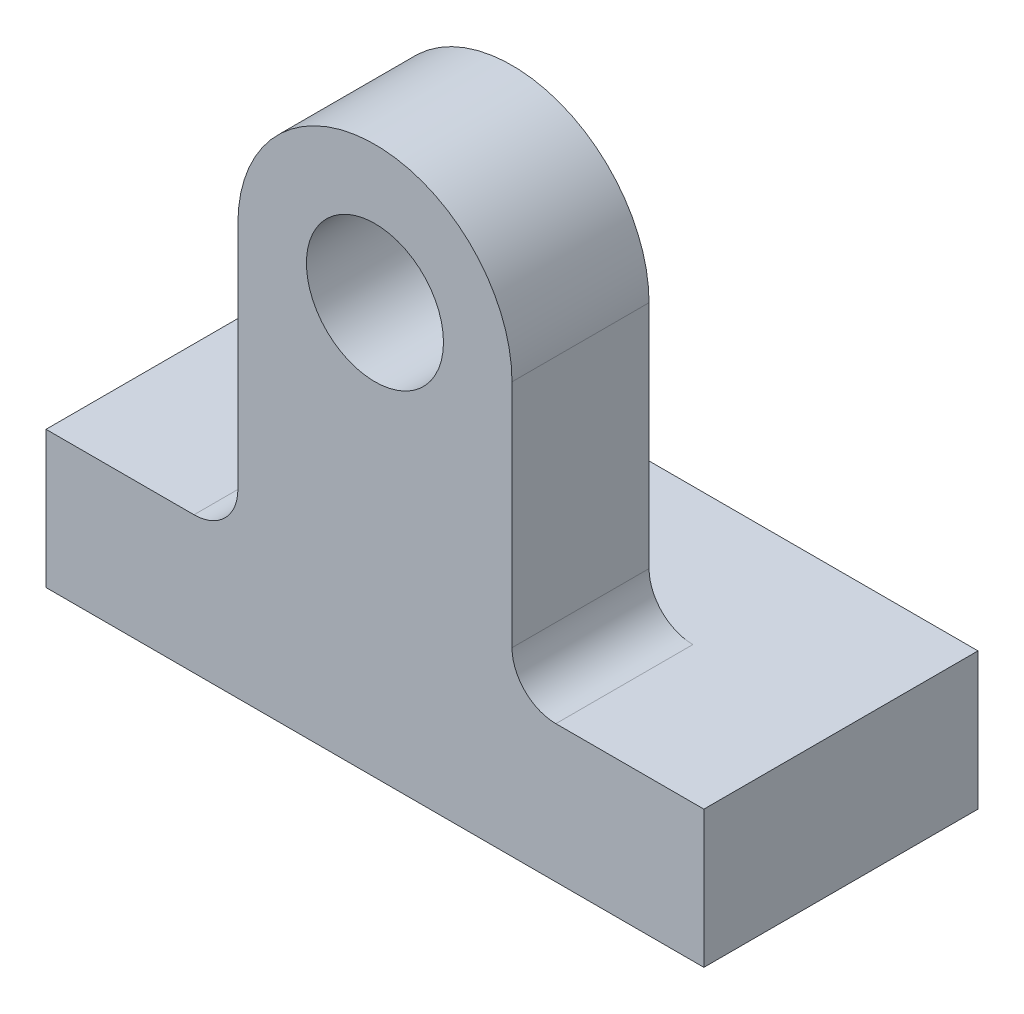
ISO-10303-21;
HEADER;
FILE_DESCRIPTION(('STEP AP214'),'2;1');
FILE_NAME('part.step','',(''),(''),'','','');
FILE_SCHEMA(('AUTOMOTIVE_DESIGN { 1 0 10303 214 1 1 1 1 }'));
ENDSEC;
DATA;
#1=APPLICATION_CONTEXT('core data for automotive mechanical design processes');
#2=APPLICATION_PROTOCOL_DEFINITION('international standard','automotive_design',2000,#1);
#3=PRODUCT_CONTEXT('',#1,'mechanical');
#4=PRODUCT('Part','Part','',(#3));
#5=PRODUCT_RELATED_PRODUCT_CATEGORY('part','',(#4));
#6=PRODUCT_DEFINITION_FORMATION('','',#4);
#7=PRODUCT_DEFINITION_CONTEXT('part definition',#1,'design');
#8=PRODUCT_DEFINITION('design','',#6,#7);
#9=PRODUCT_DEFINITION_SHAPE('','',#8);
#10=(LENGTH_UNIT() NAMED_UNIT(*) SI_UNIT(.MILLI.,.METRE.));
#11=(NAMED_UNIT(*) PLANE_ANGLE_UNIT() SI_UNIT($,.RADIAN.));
#12=(NAMED_UNIT(*) SI_UNIT($,.STERADIAN.) SOLID_ANGLE_UNIT());
#13=UNCERTAINTY_MEASURE_WITH_UNIT(LENGTH_MEASURE(1.E-05),#10,'distance_accuracy_value','');
#14=(GEOMETRIC_REPRESENTATION_CONTEXT(3) GLOBAL_UNCERTAINTY_ASSIGNED_CONTEXT((#13)) GLOBAL_UNIT_ASSIGNED_CONTEXT((#10,
#11,#12)) REPRESENTATION_CONTEXT('',''));
#15=CARTESIAN_POINT('',(0.,0.,0.));
#16=DIRECTION('',(0.,0.,1.));
#17=DIRECTION('',(1.,0.,0.));
#18=AXIS2_PLACEMENT_3D('',#15,#16,#17);
#19=CARTESIAN_POINT('',(0.,25.,50.));
#20=DIRECTION('',(0.,1.,0.));
#21=DIRECTION('',(-1.,0.,0.));
#22=AXIS2_PLACEMENT_3D('',#19,#20,#21);
#23=PLANE('',#22);
#24=DIRECTION('',(-1.,0.,0.));
#25=VECTOR('',#24,1.);
#26=CARTESIAN_POINT('',(0.,25.,25.));
#27=LINE('',#26,#25);
#28=CARTESIAN_POINT('',(33.,25.,25.));
#29=VERTEX_POINT('',#28);
#30=CARTESIAN_POINT('',(-33.,25.,25.));
#31=VERTEX_POINT('',#30);
#32=EDGE_CURVE('E126',#29,#31,#27,.T.);
#33=ORIENTED_EDGE('',*,*,#32,.F.);
#34=DIRECTION('',(0.,0.,1.));
#35=VECTOR('',#34,1.);
#36=CARTESIAN_POINT('',(33.,25.,50.));
#37=LINE('',#36,#35);
#38=CARTESIAN_POINT('',(33.,25.,50.));
#39=VERTEX_POINT('',#38);
#40=EDGE_CURVE('E200',#29,#39,#37,.T.);
#41=ORIENTED_EDGE('',*,*,#40,.T.);
#42=DIRECTION('',(1.,0.,0.));
#43=VECTOR('',#42,1.);
#44=CARTESIAN_POINT('',(0.,25.,50.));
#45=LINE('',#44,#43);
#46=CARTESIAN_POINT('',(60.,25.,50.));
#47=VERTEX_POINT('',#46);
#48=EDGE_CURVE('E158',#39,#47,#45,.T.);
#49=ORIENTED_EDGE('',*,*,#48,.T.);
#50=DIRECTION('',(0.,0.,-1.));
#51=VECTOR('',#50,1.);
#52=CARTESIAN_POINT('',(60.,25.,50.));
#53=LINE('',#52,#51);
#54=CARTESIAN_POINT('',(60.,25.,0.));
#55=VERTEX_POINT('',#54);
#56=EDGE_CURVE('E169',#47,#55,#53,.T.);
#57=ORIENTED_EDGE('',*,*,#56,.T.);
#58=DIRECTION('',(1.,0.,0.));
#59=VECTOR('',#58,1.);
#60=CARTESIAN_POINT('',(0.,25.,0.));
#61=LINE('',#60,#59);
#62=CARTESIAN_POINT('',(-60.,25.,0.));
#63=VERTEX_POINT('',#62);
#64=EDGE_CURVE('E147',#63,#55,#61,.T.);
#65=ORIENTED_EDGE('',*,*,#64,.F.);
#66=DIRECTION('',(0.,0.,-1.));
#67=VECTOR('',#66,1.);
#68=CARTESIAN_POINT('',(-60.,25.,50.));
#69=LINE('',#68,#67);
#70=CARTESIAN_POINT('',(-60.,25.,50.));
#71=VERTEX_POINT('',#70);
#72=EDGE_CURVE('E193',#71,#63,#69,.T.);
#73=ORIENTED_EDGE('',*,*,#72,.F.);
#74=CARTESIAN_POINT('',(-33.,25.,50.));
#75=VERTEX_POINT('',#74);
#76=EDGE_CURVE('E153',#71,#75,#45,.T.);
#77=ORIENTED_EDGE('',*,*,#76,.T.);
#78=DIRECTION('',(0.,0.,1.));
#79=VECTOR('',#78,1.);
#80=CARTESIAN_POINT('',(-33.,25.,50.));
#81=LINE('',#80,#79);
#82=EDGE_CURVE('E196',#75,#31,#81,.F.);
#83=ORIENTED_EDGE('',*,*,#82,.T.);
#84=EDGE_LOOP('',(#33,#41,#49,#57,#65,#73,#77,#83));
#85=FACE_BOUND('',#84,.T.);
#86=ADVANCED_FACE('F37',(#85),#23,.T.);
#87=CARTESIAN_POINT('',(-60.,0.,50.));
#88=DIRECTION('',(-1.,0.,0.));
#89=DIRECTION('',(0.,0.,1.));
#90=AXIS2_PLACEMENT_3D('',#87,#88,#89);
#91=PLANE('',#90);
#92=DIRECTION('',(0.,1.,0.));
#93=VECTOR('',#92,1.);
#94=CARTESIAN_POINT('',(-60.,0.,0.));
#95=LINE('',#94,#93);
#96=CARTESIAN_POINT('',(-60.,0.,0.));
#97=VERTEX_POINT('',#96);
#98=EDGE_CURVE('E173',#97,#63,#95,.T.);
#99=ORIENTED_EDGE('',*,*,#98,.F.);
#100=DIRECTION('',(0.,0.,-1.));
#101=VECTOR('',#100,1.);
#102=CARTESIAN_POINT('',(-60.,0.,50.));
#103=LINE('',#102,#101);
#104=CARTESIAN_POINT('',(-60.,0.,50.));
#105=VERTEX_POINT('',#104);
#106=EDGE_CURVE('E190',#105,#97,#103,.T.);
#107=ORIENTED_EDGE('',*,*,#106,.F.);
#108=DIRECTION('',(0.,1.,0.));
#109=VECTOR('',#108,1.);
#110=CARTESIAN_POINT('',(-60.,0.,50.));
#111=LINE('',#110,#109);
#112=EDGE_CURVE('E157',#105,#71,#111,.T.);
#113=ORIENTED_EDGE('',*,*,#112,.T.);
#114=ORIENTED_EDGE('',*,*,#72,.T.);
#115=EDGE_LOOP('',(#99,#107,#113,#114));
#116=FACE_BOUND('',#115,.T.);
#117=ADVANCED_FACE('F282',(#116),#91,.T.);
#118=CARTESIAN_POINT('',(0.,0.,50.));
#119=DIRECTION('',(0.,1.,0.));
#120=DIRECTION('',(-1.,0.,0.));
#121=AXIS2_PLACEMENT_3D('',#118,#119,#120);
#122=PLANE('',#121);
#123=DIRECTION('',(1.,0.,0.));
#124=VECTOR('',#123,1.);
#125=CARTESIAN_POINT('',(0.,0.,0.));
#126=LINE('',#125,#124);
#127=CARTESIAN_POINT('',(60.,0.,0.));
#128=VERTEX_POINT('',#127);
#129=EDGE_CURVE('E177',#97,#128,#126,.T.);
#130=ORIENTED_EDGE('',*,*,#129,.T.);
#131=DIRECTION('',(0.,0.,-1.));
#132=VECTOR('',#131,1.);
#133=CARTESIAN_POINT('',(60.,0.,50.));
#134=LINE('',#133,#132);
#135=CARTESIAN_POINT('',(60.,0.,50.));
#136=VERTEX_POINT('',#135);
#137=EDGE_CURVE('E186',#136,#128,#134,.T.);
#138=ORIENTED_EDGE('',*,*,#137,.F.);
#139=DIRECTION('',(1.,0.,0.));
#140=VECTOR('',#139,1.);
#141=CARTESIAN_POINT('',(0.,0.,50.));
#142=LINE('',#141,#140);
#143=EDGE_CURVE('E162',#105,#136,#142,.T.);
#144=ORIENTED_EDGE('',*,*,#143,.F.);
#145=ORIENTED_EDGE('',*,*,#106,.T.);
#146=EDGE_LOOP('',(#130,#138,#144,#145));
#147=FACE_BOUND('',#146,.T.);
#148=ADVANCED_FACE('F284',(#147),#122,.F.);
#149=CARTESIAN_POINT('',(60.,0.,50.));
#150=DIRECTION('',(-1.,0.,0.));
#151=DIRECTION('',(0.,-1.,0.));
#152=AXIS2_PLACEMENT_3D('',#149,#150,#151);
#153=PLANE('',#152);
#154=DIRECTION('',(0.,1.,0.));
#155=VECTOR('',#154,1.);
#156=CARTESIAN_POINT('',(60.,0.,0.));
#157=LINE('',#156,#155);
#158=EDGE_CURVE('E180',#128,#55,#157,.T.);
#159=ORIENTED_EDGE('',*,*,#158,.T.);
#160=ORIENTED_EDGE('',*,*,#56,.F.);
#161=DIRECTION('',(0.,1.,0.));
#162=VECTOR('',#161,1.);
#163=CARTESIAN_POINT('',(60.,0.,50.));
#164=LINE('',#163,#162);
#165=EDGE_CURVE('E165',#136,#47,#164,.T.);
#166=ORIENTED_EDGE('',*,*,#165,.F.);
#167=ORIENTED_EDGE('',*,*,#137,.T.);
#168=EDGE_LOOP('',(#159,#160,#166,#167));
#169=FACE_BOUND('',#168,.T.);
#170=ADVANCED_FACE('F275',(#169),#153,.F.);
#171=CARTESIAN_POINT('',(0.,0.,50.));
#172=DIRECTION('',(0.,0.,1.));
#173=DIRECTION('',(1.,0.,0.));
#174=AXIS2_PLACEMENT_3D('',#171,#172,#173);
#175=PLANE('',#174);
#176=ORIENTED_EDGE('',*,*,#76,.F.);
#177=ORIENTED_EDGE('',*,*,#112,.F.);
#178=ORIENTED_EDGE('',*,*,#143,.T.);
#179=ORIENTED_EDGE('',*,*,#165,.T.);
#180=ORIENTED_EDGE('',*,*,#48,.F.);
#181=CARTESIAN_POINT('',(33.,33.,50.));
#182=DIRECTION('',(0.,0.,1.));
#183=DIRECTION('',(1.,0.,0.));
#184=AXIS2_PLACEMENT_3D('',#181,#182,#183);
#185=CIRCLE('',#184,8.);
#186=CARTESIAN_POINT('',(25.,33.,50.));
#187=VERTEX_POINT('',#186);
#188=EDGE_CURVE('E209',#39,#187,#185,.F.);
#189=ORIENTED_EDGE('',*,*,#188,.T.);
#190=DIRECTION('',(0.,1.,0.));
#191=VECTOR('',#190,1.);
#192=CARTESIAN_POINT('',(25.,0.,50.));
#193=LINE('',#192,#191);
#194=CARTESIAN_POINT('',(25.,75.,50.));
#195=VERTEX_POINT('',#194);
#196=EDGE_CURVE('E231',#187,#195,#193,.T.);
#197=ORIENTED_EDGE('',*,*,#196,.T.);
#198=CARTESIAN_POINT('',(0.,75.,50.));
#199=DIRECTION('',(0.,0.,1.));
#200=DIRECTION('',(1.,0.,0.));
#201=AXIS2_PLACEMENT_3D('',#198,#199,#200);
#202=CIRCLE('',#201,25.);
#203=CARTESIAN_POINT('',(-25.,75.,50.));
#204=VERTEX_POINT('',#203);
#205=EDGE_CURVE('E139',#204,#195,#202,.F.);
#206=ORIENTED_EDGE('',*,*,#205,.F.);
#207=DIRECTION('',(0.,1.,0.));
#208=VECTOR('',#207,1.);
#209=CARTESIAN_POINT('',(-25.,0.,50.));
#210=LINE('',#209,#208);
#211=CARTESIAN_POINT('',(-25.,33.,50.));
#212=VERTEX_POINT('',#211);
#213=EDGE_CURVE('E222',#212,#204,#210,.T.);
#214=ORIENTED_EDGE('',*,*,#213,.F.);
#215=CARTESIAN_POINT('',(-33.,33.,50.));
#216=DIRECTION('',(0.,0.,1.));
#217=DIRECTION('',(1.,0.,0.));
#218=AXIS2_PLACEMENT_3D('',#215,#216,#217);
#219=CIRCLE('',#218,8.);
#220=EDGE_CURVE('E46',#212,#75,#219,.F.);
#221=ORIENTED_EDGE('',*,*,#220,.T.);
#222=EDGE_LOOP('',(#176,#177,#178,#179,#180,#189,#197,#206,#214,#221));
#223=FACE_BOUND('',#222,.T.);
#224=CARTESIAN_POINT('',(0.,75.,50.));
#225=DIRECTION('',(0.,0.,1.));
#226=DIRECTION('',(1.,0.,0.));
#227=AXIS2_PLACEMENT_3D('',#224,#225,#226);
#228=CIRCLE('',#227,12.5);
#229=CARTESIAN_POINT('',(12.5,75.,50.));
#230=VERTEX_POINT('',#229);
#231=EDGE_CURVE('E237',#230,#230,#228,.T.);
#232=ORIENTED_EDGE('',*,*,#231,.F.);
#233=EDGE_LOOP('',(#232));
#234=FACE_BOUND('',#233,.T.);
#235=ADVANCED_FACE('F219',(#223,#234),#175,.T.);
#236=CARTESIAN_POINT('',(0.,0.,0.));
#237=DIRECTION('',(0.,0.,1.));
#238=DIRECTION('',(1.,0.,0.));
#239=AXIS2_PLACEMENT_3D('',#236,#237,#238);
#240=PLANE('',#239);
#241=ORIENTED_EDGE('',*,*,#64,.T.);
#242=ORIENTED_EDGE('',*,*,#158,.F.);
#243=ORIENTED_EDGE('',*,*,#129,.F.);
#244=ORIENTED_EDGE('',*,*,#98,.T.);
#245=EDGE_LOOP('',(#241,#242,#243,#244));
#246=FACE_BOUND('',#245,.T.);
#247=ADVANCED_FACE('F280',(#246),#240,.F.);
#248=CARTESIAN_POINT('',(-25.,0.,25.));
#249=DIRECTION('',(1.,0.,0.));
#250=DIRECTION('',(0.,0.,-1.));
#251=AXIS2_PLACEMENT_3D('',#248,#249,#250);
#252=PLANE('',#251);
#253=DIRECTION('',(0.,1.,0.));
#254=VECTOR('',#253,1.);
#255=CARTESIAN_POINT('',(-25.,0.,25.));
#256=LINE('',#255,#254);
#257=CARTESIAN_POINT('',(-25.,33.,25.));
#258=VERTEX_POINT('',#257);
#259=CARTESIAN_POINT('',(-25.,75.,25.));
#260=VERTEX_POINT('',#259);
#261=EDGE_CURVE('E131',#258,#260,#256,.T.);
#262=ORIENTED_EDGE('',*,*,#261,.F.);
#263=DIRECTION('',(0.,0.,1.));
#264=VECTOR('',#263,1.);
#265=CARTESIAN_POINT('',(-25.,33.,25.));
#266=LINE('',#265,#264);
#267=EDGE_CURVE('E206',#258,#212,#266,.T.);
#268=ORIENTED_EDGE('',*,*,#267,.T.);
#269=ORIENTED_EDGE('',*,*,#213,.T.);
#270=DIRECTION('',(0.,0.,1.));
#271=VECTOR('',#270,1.);
#272=CARTESIAN_POINT('',(-25.,75.,25.));
#273=LINE('',#272,#271);
#274=EDGE_CURVE('E141',#260,#204,#273,.T.);
#275=ORIENTED_EDGE('',*,*,#274,.F.);
#276=EDGE_LOOP('',(#262,#268,#269,#275));
#277=FACE_BOUND('',#276,.T.);
#278=ADVANCED_FACE('F226',(#277),#252,.F.);
#279=CARTESIAN_POINT('',(0.,75.,25.));
#280=DIRECTION('',(0.,0.,1.));
#281=DIRECTION('',(1.,0.,0.));
#282=AXIS2_PLACEMENT_3D('',#279,#280,#281);
#283=CYLINDRICAL_SURFACE('',#282,25.);
#284=ORIENTED_EDGE('',*,*,#205,.T.);
#285=DIRECTION('',(0.,0.,1.));
#286=VECTOR('',#285,1.);
#287=CARTESIAN_POINT('',(25.,75.,25.));
#288=LINE('',#287,#286);
#289=CARTESIAN_POINT('',(25.,75.,25.));
#290=VERTEX_POINT('',#289);
#291=EDGE_CURVE('E118',#290,#195,#288,.T.);
#292=ORIENTED_EDGE('',*,*,#291,.F.);
#293=CARTESIAN_POINT('',(0.,75.,25.));
#294=DIRECTION('',(0.,0.,1.));
#295=DIRECTION('',(1.,0.,0.));
#296=AXIS2_PLACEMENT_3D('',#293,#294,#295);
#297=CIRCLE('',#296,25.);
#298=EDGE_CURVE('E125',#260,#290,#297,.F.);
#299=ORIENTED_EDGE('',*,*,#298,.F.);
#300=ORIENTED_EDGE('',*,*,#274,.T.);
#301=EDGE_LOOP('',(#284,#292,#299,#300));
#302=FACE_BOUND('',#301,.T.);
#303=ADVANCED_FACE('F137',(#302),#283,.T.);
#304=CARTESIAN_POINT('',(25.,0.,25.));
#305=DIRECTION('',(1.,0.,0.));
#306=DIRECTION('',(0.,0.,-1.));
#307=AXIS2_PLACEMENT_3D('',#304,#305,#306);
#308=PLANE('',#307);
#309=ORIENTED_EDGE('',*,*,#196,.F.);
#310=DIRECTION('',(0.,0.,1.));
#311=VECTOR('',#310,1.);
#312=CARTESIAN_POINT('',(25.,33.,25.));
#313=LINE('',#312,#311);
#314=CARTESIAN_POINT('',(25.,33.,25.));
#315=VERTEX_POINT('',#314);
#316=EDGE_CURVE('E121',#187,#315,#313,.F.);
#317=ORIENTED_EDGE('',*,*,#316,.T.);
#318=DIRECTION('',(0.,1.,0.));
#319=VECTOR('',#318,1.);
#320=CARTESIAN_POINT('',(25.,0.,25.));
#321=LINE('',#320,#319);
#322=EDGE_CURVE('E113',#315,#290,#321,.T.);
#323=ORIENTED_EDGE('',*,*,#322,.T.);
#324=ORIENTED_EDGE('',*,*,#291,.T.);
#325=EDGE_LOOP('',(#309,#317,#323,#324));
#326=FACE_BOUND('',#325,.T.);
#327=ADVANCED_FACE('F116',(#326),#308,.T.);
#328=CARTESIAN_POINT('',(0.,75.,25.));
#329=DIRECTION('',(0.,0.,1.));
#330=DIRECTION('',(1.,0.,0.));
#331=AXIS2_PLACEMENT_3D('',#328,#329,#330);
#332=CYLINDRICAL_SURFACE('',#331,12.5);
#333=CARTESIAN_POINT('',(0.,75.,25.));
#334=DIRECTION('',(0.,0.,1.));
#335=DIRECTION('',(1.,0.,0.));
#336=AXIS2_PLACEMENT_3D('',#333,#334,#335);
#337=CIRCLE('',#336,12.5);
#338=CARTESIAN_POINT('',(12.5,75.,25.));
#339=VERTEX_POINT('',#338);
#340=EDGE_CURVE('E142',#339,#339,#337,.T.);
#341=ORIENTED_EDGE('',*,*,#340,.F.);
#342=EDGE_LOOP('',(#341));
#343=FACE_BOUND('',#342,.T.);
#344=ORIENTED_EDGE('',*,*,#231,.T.);
#345=EDGE_LOOP('',(#344));
#346=FACE_BOUND('',#345,.T.);
#347=ADVANCED_FACE('F303',(#343,#346),#332,.F.);
#348=CARTESIAN_POINT('',(0.,0.,25.));
#349=DIRECTION('',(0.,0.,1.));
#350=DIRECTION('',(1.,0.,0.));
#351=AXIS2_PLACEMENT_3D('',#348,#349,#350);
#352=PLANE('',#351);
#353=ORIENTED_EDGE('',*,*,#32,.T.);
#354=CARTESIAN_POINT('',(-33.,33.,25.));
#355=DIRECTION('',(0.,0.,1.));
#356=DIRECTION('',(1.,0.,0.));
#357=AXIS2_PLACEMENT_3D('',#354,#355,#356);
#358=CIRCLE('',#357,8.);
#359=EDGE_CURVE('E11',#31,#258,#358,.T.);
#360=ORIENTED_EDGE('',*,*,#359,.T.);
#361=ORIENTED_EDGE('',*,*,#261,.T.);
#362=ORIENTED_EDGE('',*,*,#298,.T.);
#363=ORIENTED_EDGE('',*,*,#322,.F.);
#364=CARTESIAN_POINT('',(33.,33.,25.));
#365=DIRECTION('',(0.,0.,1.));
#366=DIRECTION('',(1.,0.,0.));
#367=AXIS2_PLACEMENT_3D('',#364,#365,#366);
#368=CIRCLE('',#367,8.);
#369=EDGE_CURVE('E212',#315,#29,#368,.T.);
#370=ORIENTED_EDGE('',*,*,#369,.T.);
#371=EDGE_LOOP('',(#353,#360,#361,#362,#363,#370));
#372=FACE_BOUND('',#371,.T.);
#373=ORIENTED_EDGE('',*,*,#340,.T.);
#374=EDGE_LOOP('',(#373));
#375=FACE_BOUND('',#374,.T.);
#376=ADVANCED_FACE('F129',(#372,#375),#352,.F.);
#377=CARTESIAN_POINT('',(33.,33.,50.));
#378=DIRECTION('',(0.,0.,-1.));
#379=DIRECTION('',(-1.,0.,0.));
#380=AXIS2_PLACEMENT_3D('',#377,#378,#379);
#381=CYLINDRICAL_SURFACE('',#380,8.);
#382=ORIENTED_EDGE('',*,*,#369,.F.);
#383=ORIENTED_EDGE('',*,*,#316,.F.);
#384=ORIENTED_EDGE('',*,*,#188,.F.);
#385=ORIENTED_EDGE('',*,*,#40,.F.);
#386=EDGE_LOOP('',(#382,#383,#384,#385));
#387=FACE_BOUND('',#386,.T.);
#388=ADVANCED_FACE('F297',(#387),#381,.F.);
#389=CARTESIAN_POINT('',(-33.,33.,25.));
#390=DIRECTION('',(0.,0.,1.));
#391=DIRECTION('',(1.,0.,0.));
#392=AXIS2_PLACEMENT_3D('',#389,#390,#391);
#393=CYLINDRICAL_SURFACE('',#392,8.);
#394=ORIENTED_EDGE('',*,*,#359,.F.);
#395=ORIENTED_EDGE('',*,*,#82,.F.);
#396=ORIENTED_EDGE('',*,*,#220,.F.);
#397=ORIENTED_EDGE('',*,*,#267,.F.);
#398=EDGE_LOOP('',(#394,#395,#396,#397));
#399=FACE_BOUND('',#398,.T.);
#400=ADVANCED_FACE('F39',(#399),#393,.F.);
#401=CLOSED_SHELL('',(#86,#117,#148,#170,#235,#247,#278,#303,#327,#347,#376,#388,#400));
#402=MANIFOLD_SOLID_BREP('B2',#401);
#403=ADVANCED_BREP_SHAPE_REPRESENTATION('',(#18,#402),#14);
#404=SHAPE_DEFINITION_REPRESENTATION(#9,#403);
ENDSEC;
END-ISO-10303-21;
